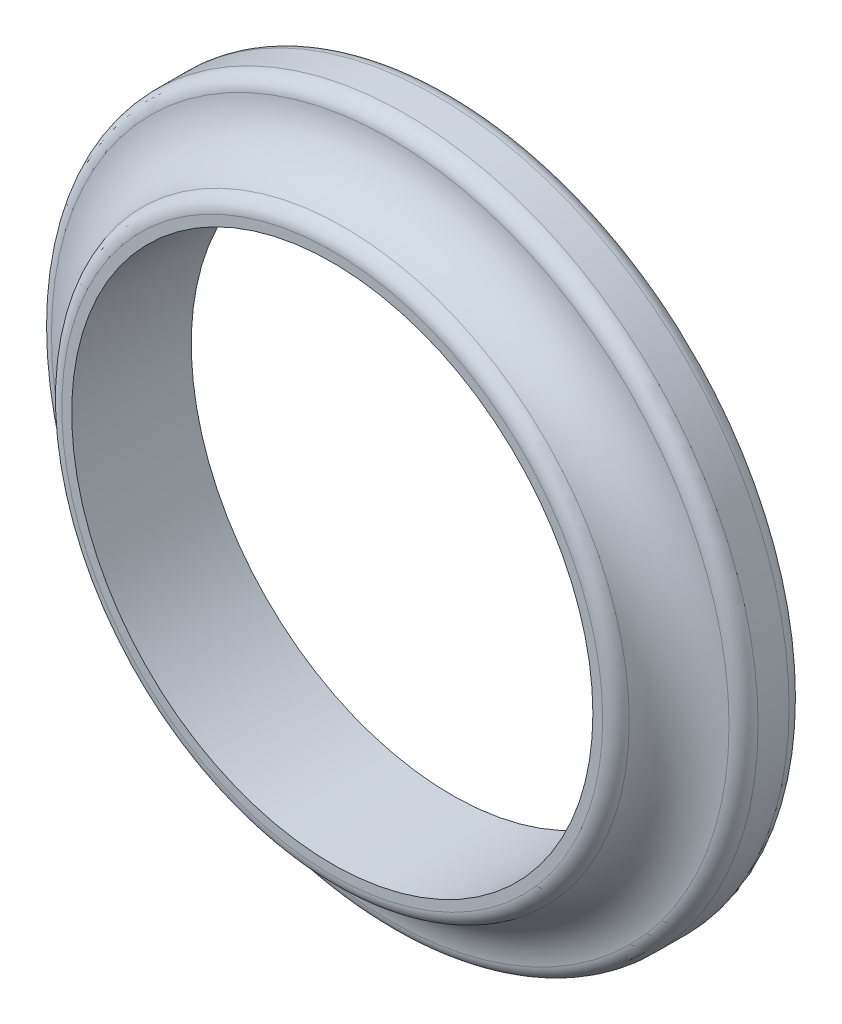
ISO-10303-21;
HEADER;
FILE_DESCRIPTION(('STEP AP214'),'2;1');
FILE_NAME('part.step','',(''),(''),'','','');
FILE_SCHEMA(('AUTOMOTIVE_DESIGN { 1 0 10303 214 1 1 1 1 }'));
ENDSEC;
DATA;
#1=APPLICATION_CONTEXT('core data for automotive mechanical design processes');
#2=APPLICATION_PROTOCOL_DEFINITION('international standard','automotive_design',2000,#1);
#3=PRODUCT_CONTEXT('',#1,'mechanical');
#4=PRODUCT('Part','Part','',(#3));
#5=PRODUCT_RELATED_PRODUCT_CATEGORY('part','',(#4));
#6=PRODUCT_DEFINITION_FORMATION('','',#4);
#7=PRODUCT_DEFINITION_CONTEXT('part definition',#1,'design');
#8=PRODUCT_DEFINITION('design','',#6,#7);
#9=PRODUCT_DEFINITION_SHAPE('','',#8);
#10=(LENGTH_UNIT() NAMED_UNIT(*) SI_UNIT(.MILLI.,.METRE.));
#11=(NAMED_UNIT(*) PLANE_ANGLE_UNIT() SI_UNIT($,.RADIAN.));
#12=(NAMED_UNIT(*) SI_UNIT($,.STERADIAN.) SOLID_ANGLE_UNIT());
#13=UNCERTAINTY_MEASURE_WITH_UNIT(LENGTH_MEASURE(1.E-05),#10,'distance_accuracy_value','');
#14=(GEOMETRIC_REPRESENTATION_CONTEXT(3) GLOBAL_UNCERTAINTY_ASSIGNED_CONTEXT((#13)) GLOBAL_UNIT_ASSIGNED_CONTEXT((#10,
#11,#12)) REPRESENTATION_CONTEXT('',''));
#15=CARTESIAN_POINT('',(0.,0.,0.));
#16=DIRECTION('',(0.,0.,1.));
#17=DIRECTION('',(1.,0.,0.));
#18=AXIS2_PLACEMENT_3D('',#15,#16,#17);
#19=CARTESIAN_POINT('',(0.,0.,4.));
#20=DIRECTION('',(0.,0.,-1.));
#21=DIRECTION('',(-1.,0.,0.));
#22=AXIS2_PLACEMENT_3D('',#19,#20,#21);
#23=CYLINDRICAL_SURFACE('',#22,23.);
#24=CARTESIAN_POINT('',(0.,0.,1.));
#25=DIRECTION('',(0.,0.,1.));
#26=DIRECTION('',(1.,0.,0.));
#27=AXIS2_PLACEMENT_3D('',#24,#25,#26);
#28=CIRCLE('',#27,23.);
#29=CARTESIAN_POINT('',(23.,0.,1.));
#30=VERTEX_POINT('',#29);
#31=EDGE_CURVE('E51',#30,#30,#28,.T.);
#32=ORIENTED_EDGE('',*,*,#31,.T.);
#33=EDGE_LOOP('',(#32));
#34=FACE_BOUND('',#33,.T.);
#35=CARTESIAN_POINT('',(0.,0.,3.02456252198729));
#36=DIRECTION('',(0.,0.,-1.));
#37=DIRECTION('',(-1.,0.,0.));
#38=AXIS2_PLACEMENT_3D('',#35,#36,#37);
#39=CIRCLE('',#38,23.);
#40=CARTESIAN_POINT('',(-23.,0.,3.02456252198729));
#41=VERTEX_POINT('',#40);
#42=EDGE_CURVE('E55',#41,#41,#39,.T.);
#43=ORIENTED_EDGE('',*,*,#42,.T.);
#44=EDGE_LOOP('',(#43));
#45=FACE_BOUND('',#44,.T.);
#46=ADVANCED_FACE('F40',(#34,#45),#23,.T.);
#47=CARTESIAN_POINT('',(0.,0.,0.));
#48=DIRECTION('',(0.,0.,1.));
#49=DIRECTION('',(1.,0.,0.));
#50=AXIS2_PLACEMENT_3D('',#47,#48,#49);
#51=PLANE('',#50);
#52=CARTESIAN_POINT('',(0.,0.,0.));
#53=DIRECTION('',(0.,0.,1.));
#54=DIRECTION('',(1.,0.,0.));
#55=AXIS2_PLACEMENT_3D('',#52,#53,#54);
#56=CIRCLE('',#55,22.);
#57=CARTESIAN_POINT('',(22.,0.,0.));
#58=VERTEX_POINT('',#57);
#59=EDGE_CURVE('E47',#58,#58,#56,.F.);
#60=ORIENTED_EDGE('',*,*,#59,.T.);
#61=EDGE_LOOP('',(#60));
#62=FACE_BOUND('',#61,.T.);
#63=CARTESIAN_POINT('',(0.,0.,0.));
#64=DIRECTION('',(0.,0.,1.));
#65=DIRECTION('',(1.,0.,0.));
#66=AXIS2_PLACEMENT_3D('',#63,#64,#65);
#67=CIRCLE('',#66,17.);
#68=CARTESIAN_POINT('',(17.,0.,0.));
#69=VERTEX_POINT('',#68);
#70=EDGE_CURVE('E66',#69,#69,#67,.T.);
#71=ORIENTED_EDGE('',*,*,#70,.T.);
#72=EDGE_LOOP('',(#71));
#73=FACE_BOUND('',#72,.T.);
#74=ADVANCED_FACE('F87',(#62,#73),#51,.F.);
#75=CARTESIAN_POINT('',(0.,0.,0.));
#76=DIRECTION('',(0.,0.,1.));
#77=DIRECTION('',(1.,0.,0.));
#78=AXIS2_PLACEMENT_3D('',#75,#76,#77);
#79=CYLINDRICAL_SURFACE('',#78,17.);
#80=ORIENTED_EDGE('',*,*,#70,.F.);
#81=EDGE_LOOP('',(#80));
#82=FACE_BOUND('',#81,.T.);
#83=CARTESIAN_POINT('',(0.,0.,7.8));
#84=DIRECTION('',(0.,0.,1.));
#85=DIRECTION('',(1.,0.,0.));
#86=AXIS2_PLACEMENT_3D('',#83,#84,#85);
#87=CIRCLE('',#86,17.);
#88=CARTESIAN_POINT('',(17.,0.,7.8));
#89=VERTEX_POINT('',#88);
#90=EDGE_CURVE('E69',#89,#89,#87,.T.);
#91=ORIENTED_EDGE('',*,*,#90,.T.);
#92=EDGE_LOOP('',(#91));
#93=FACE_BOUND('',#92,.T.);
#94=ADVANCED_FACE('F73',(#82,#93),#79,.F.);
#95=CARTESIAN_POINT('',(0.,0.,7.8));
#96=DIRECTION('',(0.,0.,1.));
#97=DIRECTION('',(1.,0.,0.));
#98=AXIS2_PLACEMENT_3D('',#95,#96,#97);
#99=PLANE('',#98);
#100=CARTESIAN_POINT('',(0.,0.,7.8));
#101=DIRECTION('',(0.,0.,1.));
#102=DIRECTION('',(1.,0.,0.));
#103=AXIS2_PLACEMENT_3D('',#100,#101,#102);
#104=CIRCLE('',#103,17.641132431283);
#105=CARTESIAN_POINT('',(17.641132431283,0.,7.8));
#106=VERTEX_POINT('',#105);
#107=EDGE_CURVE('E63',#106,#106,#104,.T.);
#108=ORIENTED_EDGE('',*,*,#107,.T.);
#109=EDGE_LOOP('',(#108));
#110=FACE_BOUND('',#109,.T.);
#111=ORIENTED_EDGE('',*,*,#90,.F.);
#112=EDGE_LOOP('',(#111));
#113=FACE_BOUND('',#112,.T.);
#114=ADVANCED_FACE('F75',(#110,#113),#99,.T.);
#115=CARTESIAN_POINT('',(0.,0.,8.));
#116=DIRECTION('',(0.,0.,1.));
#117=DIRECTION('',(1.,0.,0.));
#118=AXIS2_PLACEMENT_3D('',#115,#116,#117);
#119=TOROIDAL_SURFACE('',#118,22.4949968710876,4.);
#120=CARTESIAN_POINT('',(0.,0.,4.0196500175898));
#121=DIRECTION('',(0.,0.,1.));
#122=DIRECTION('',(1.,0.,0.));
#123=AXIS2_PLACEMENT_3D('',#120,#121,#122);
#124=CIRCLE('',#123,22.0989993742175);
#125=CARTESIAN_POINT('',(22.0989993742175,0.,4.0196500175898));
#126=VERTEX_POINT('',#125);
#127=EDGE_CURVE('E10',#126,#126,#124,.T.);
#128=ORIENTED_EDGE('',*,*,#127,.T.);
#129=EDGE_LOOP('',(#128));
#130=FACE_BOUND('',#129,.T.);
#131=CARTESIAN_POINT('',(0.,0.,7.03999999999999));
#132=DIRECTION('',(0.,0.,1.));
#133=DIRECTION('',(1.,0.,0.));
#134=AXIS2_PLACEMENT_3D('',#131,#132,#133);
#135=CIRCLE('',#134,18.6119053192439);
#136=CARTESIAN_POINT('',(18.6119053192439,0.,7.03999999999999));
#137=VERTEX_POINT('',#136);
#138=EDGE_CURVE('E60',#137,#137,#135,.F.);
#139=ORIENTED_EDGE('',*,*,#138,.T.);
#140=EDGE_LOOP('',(#139));
#141=FACE_BOUND('',#140,.T.);
#142=ADVANCED_FACE('F77',(#130,#141),#119,.F.);
#143=CARTESIAN_POINT('',(0.,0.,6.8));
#144=DIRECTION('',(0.,0.,-1.));
#145=DIRECTION('',(-1.,0.,0.));
#146=AXIS2_PLACEMENT_3D('',#143,#144,#145);
#147=TOROIDAL_SURFACE('',#146,17.641132431283,1.);
#148=ORIENTED_EDGE('',*,*,#138,.F.);
#149=EDGE_LOOP('',(#148));
#150=FACE_BOUND('',#149,.T.);
#151=ORIENTED_EDGE('',*,*,#107,.F.);
#152=EDGE_LOOP('',(#151));
#153=FACE_BOUND('',#152,.T.);
#154=ADVANCED_FACE('F85',(#150,#153),#147,.T.);
#155=CARTESIAN_POINT('',(0.,0.,1.));
#156=DIRECTION('',(0.,0.,1.));
#157=DIRECTION('',(1.,0.,0.));
#158=AXIS2_PLACEMENT_3D('',#155,#156,#157);
#159=TOROIDAL_SURFACE('',#158,22.,1.);
#160=ORIENTED_EDGE('',*,*,#59,.F.);
#161=EDGE_LOOP('',(#160));
#162=FACE_BOUND('',#161,.T.);
#163=ORIENTED_EDGE('',*,*,#31,.F.);
#164=EDGE_LOOP('',(#163));
#165=FACE_BOUND('',#164,.T.);
#166=ADVANCED_FACE('F101',(#162,#165),#159,.T.);
#167=CARTESIAN_POINT('',(0.,0.,3.02456252198729));
#168=DIRECTION('',(0.,0.,-1.));
#169=DIRECTION('',(-1.,0.,0.));
#170=AXIS2_PLACEMENT_3D('',#167,#168,#169);
#171=TOROIDAL_SURFACE('',#170,22.,1.);
#172=ORIENTED_EDGE('',*,*,#42,.F.);
#173=EDGE_LOOP('',(#172));
#174=FACE_BOUND('',#173,.T.);
#175=ORIENTED_EDGE('',*,*,#127,.F.);
#176=EDGE_LOOP('',(#175));
#177=FACE_BOUND('',#176,.T.);
#178=ADVANCED_FACE('F42',(#174,#177),#171,.T.);
#179=CLOSED_SHELL('',(#46,#74,#94,#114,#142,#154,#166,#178));
#180=MANIFOLD_SOLID_BREP('B2',#179);
#181=ADVANCED_BREP_SHAPE_REPRESENTATION('',(#18,#180),#14);
#182=SHAPE_DEFINITION_REPRESENTATION(#9,#181);
ENDSEC;
END-ISO-10303-21;
